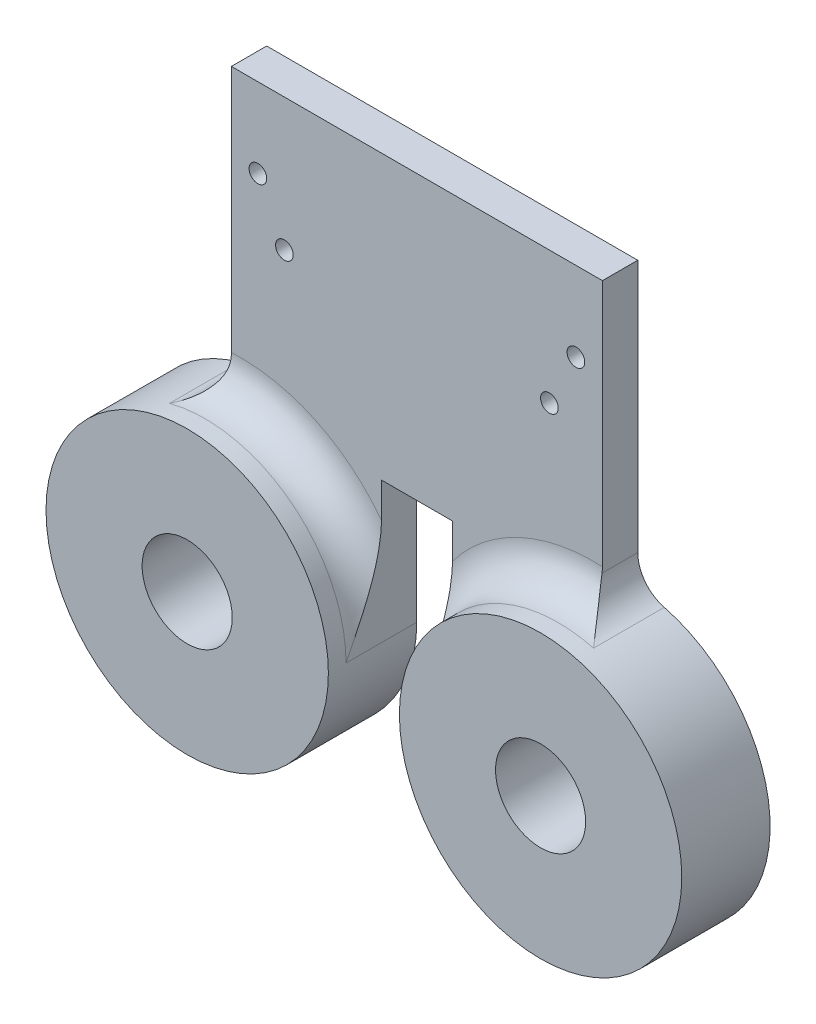
ISO-10303-21;
HEADER;
FILE_DESCRIPTION(('STEP AP214'),'2;1');
FILE_NAME('part.step','',(''),(''),'','','');
FILE_SCHEMA(('AUTOMOTIVE_DESIGN { 1 0 10303 214 1 1 1 1 }'));
ENDSEC;
DATA;
#1=APPLICATION_CONTEXT('core data for automotive mechanical design processes');
#2=APPLICATION_PROTOCOL_DEFINITION('international standard','automotive_design',2000,#1);
#3=PRODUCT_CONTEXT('',#1,'mechanical');
#4=PRODUCT('Part','Part','',(#3));
#5=PRODUCT_RELATED_PRODUCT_CATEGORY('part','',(#4));
#6=PRODUCT_DEFINITION_FORMATION('','',#4);
#7=PRODUCT_DEFINITION_CONTEXT('part definition',#1,'design');
#8=PRODUCT_DEFINITION('design','',#6,#7);
#9=PRODUCT_DEFINITION_SHAPE('','',#8);
#10=(LENGTH_UNIT() NAMED_UNIT(*) SI_UNIT(.MILLI.,.METRE.));
#11=(NAMED_UNIT(*) PLANE_ANGLE_UNIT() SI_UNIT($,.RADIAN.));
#12=(NAMED_UNIT(*) SI_UNIT($,.STERADIAN.) SOLID_ANGLE_UNIT());
#13=UNCERTAINTY_MEASURE_WITH_UNIT(LENGTH_MEASURE(1.E-05),#10,'distance_accuracy_value','');
#14=(GEOMETRIC_REPRESENTATION_CONTEXT(3) GLOBAL_UNCERTAINTY_ASSIGNED_CONTEXT((#13)) GLOBAL_UNIT_ASSIGNED_CONTEXT((#10,
#11,#12)) REPRESENTATION_CONTEXT('',''));
#15=CARTESIAN_POINT('',(0.,0.,0.));
#16=DIRECTION('',(0.,0.,1.));
#17=DIRECTION('',(1.,0.,0.));
#18=AXIS2_PLACEMENT_3D('',#15,#16,#17);
#19=CARTESIAN_POINT('',(-10.,-15.5,2.));
#20=DIRECTION('',(0.,0.,1.));
#21=DIRECTION('',(1.,0.,0.));
#22=AXIS2_PLACEMENT_3D('',#19,#20,#21);
#23=PLANE('',#22);
#24=CARTESIAN_POINT('',(9.,4.,2.));
#25=DIRECTION('',(0.,0.,1.));
#26=DIRECTION('',(1.,0.,0.));
#27=AXIS2_PLACEMENT_3D('',#24,#25,#26);
#28=CIRCLE('',#27,0.500000000000001);
#29=CARTESIAN_POINT('',(9.5,4.,2.));
#30=VERTEX_POINT('',#29);
#31=EDGE_CURVE('E321',#30,#30,#28,.F.);
#32=ORIENTED_EDGE('',*,*,#31,.T.);
#33=EDGE_LOOP('',(#32));
#34=FACE_BOUND('',#33,.T.);
#35=CARTESIAN_POINT('',(-9.,4.,2.));
#36=DIRECTION('',(0.,0.,1.));
#37=DIRECTION('',(1.,0.,0.));
#38=AXIS2_PLACEMENT_3D('',#35,#36,#37);
#39=CIRCLE('',#38,0.500000000000001);
#40=CARTESIAN_POINT('',(-8.5,4.,2.));
#41=VERTEX_POINT('',#40);
#42=EDGE_CURVE('E322',#41,#41,#39,.F.);
#43=ORIENTED_EDGE('',*,*,#42,.T.);
#44=EDGE_LOOP('',(#43));
#45=FACE_BOUND('',#44,.T.);
#46=CARTESIAN_POINT('',(-7.5,1.,2.));
#47=DIRECTION('',(0.,0.,1.));
#48=DIRECTION('',(1.,0.,0.));
#49=AXIS2_PLACEMENT_3D('',#46,#47,#48);
#50=CIRCLE('',#49,0.5);
#51=CARTESIAN_POINT('',(-7.,1.,2.));
#52=VERTEX_POINT('',#51);
#53=EDGE_CURVE('E326',#52,#52,#50,.F.);
#54=ORIENTED_EDGE('',*,*,#53,.T.);
#55=EDGE_LOOP('',(#54));
#56=FACE_BOUND('',#55,.T.);
#57=CARTESIAN_POINT('',(7.5,1.,2.));
#58=DIRECTION('',(0.,0.,1.));
#59=DIRECTION('',(1.,0.,0.));
#60=AXIS2_PLACEMENT_3D('',#57,#58,#59);
#61=CIRCLE('',#60,0.5);
#62=CARTESIAN_POINT('',(8.,1.,2.));
#63=VERTEX_POINT('',#62);
#64=EDGE_CURVE('E521',#63,#63,#61,.F.);
#65=ORIENTED_EDGE('',*,*,#64,.T.);
#66=EDGE_LOOP('',(#65));
#67=FACE_BOUND('',#66,.T.);
#68=DIRECTION('',(0.,-1.,0.));
#69=VECTOR('',#68,1.);
#70=CARTESIAN_POINT('',(2.00940408272331,-15.5,2.));
#71=LINE('',#70,#69);
#72=CARTESIAN_POINT('',(2.00940408272331,-7.52506281446691,2.));
#73=VERTEX_POINT('',#72);
#74=CARTESIAN_POINT('',(2.00940408272331,-9.50313551352821,2.));
#75=VERTEX_POINT('',#74);
#76=EDGE_CURVE('E298',#73,#75,#71,.T.);
#77=ORIENTED_EDGE('',*,*,#76,.T.);
#78=CARTESIAN_POINT('',(9.99999999999999,-15.5,2.));
#79=DIRECTION('',(0.,0.,1.));
#80=DIRECTION('',(1.,0.,0.));
#81=AXIS2_PLACEMENT_3D('',#78,#79,#80);
#82=CIRCLE('',#81,9.99059591727669);
#83=CARTESIAN_POINT('',(10.5,-5.52192369330116,2.));
#84=VERTEX_POINT('',#83);
#85=EDGE_CURVE('E137',#75,#84,#82,.F.);
#86=ORIENTED_EDGE('',*,*,#85,.T.);
#87=DIRECTION('',(0.,1.,0.));
#88=VECTOR('',#87,1.);
#89=CARTESIAN_POINT('',(10.5,-7.52506281446691,2.));
#90=LINE('',#89,#88);
#91=CARTESIAN_POINT('',(10.5,8.5,2.));
#92=VERTEX_POINT('',#91);
#93=EDGE_CURVE('E130',#84,#92,#90,.T.);
#94=ORIENTED_EDGE('',*,*,#93,.T.);
#95=DIRECTION('',(-1.,0.,0.));
#96=VECTOR('',#95,1.);
#97=CARTESIAN_POINT('',(-10.5,8.5,2.));
#98=LINE('',#97,#96);
#99=CARTESIAN_POINT('',(-10.5,8.5,2.));
#100=VERTEX_POINT('',#99);
#101=EDGE_CURVE('E134',#92,#100,#98,.T.);
#102=ORIENTED_EDGE('',*,*,#101,.T.);
#103=DIRECTION('',(0.,-1.,0.));
#104=VECTOR('',#103,1.);
#105=CARTESIAN_POINT('',(-10.5,-7.52506281446691,2.));
#106=LINE('',#105,#104);
#107=CARTESIAN_POINT('',(-10.5,-5.52192369330114,2.));
#108=VERTEX_POINT('',#107);
#109=EDGE_CURVE('E149',#100,#108,#106,.T.);
#110=ORIENTED_EDGE('',*,*,#109,.T.);
#111=CARTESIAN_POINT('',(-10.,-15.5,2.));
#112=DIRECTION('',(0.,0.,1.));
#113=DIRECTION('',(1.,0.,0.));
#114=AXIS2_PLACEMENT_3D('',#111,#112,#113);
#115=CIRCLE('',#114,9.99059591727667);
#116=CARTESIAN_POINT('',(-2.00940408272333,-9.50313551352821,2.));
#117=VERTEX_POINT('',#116);
#118=EDGE_CURVE('E155',#108,#117,#115,.F.);
#119=ORIENTED_EDGE('',*,*,#118,.T.);
#120=DIRECTION('',(0.,1.,0.));
#121=VECTOR('',#120,1.);
#122=CARTESIAN_POINT('',(-2.00940408272333,-15.5,2.));
#123=LINE('',#122,#121);
#124=CARTESIAN_POINT('',(-2.00940408272333,-7.52506281446691,2.));
#125=VERTEX_POINT('',#124);
#126=EDGE_CURVE('E302',#117,#125,#123,.T.);
#127=ORIENTED_EDGE('',*,*,#126,.T.);
#128=DIRECTION('',(1.,0.,0.));
#129=VECTOR('',#128,1.);
#130=CARTESIAN_POINT('',(-2.00940408272333,-7.52506281446691,2.));
#131=LINE('',#130,#129);
#132=EDGE_CURVE('E282',#125,#73,#131,.T.);
#133=ORIENTED_EDGE('',*,*,#132,.T.);
#134=EDGE_LOOP('',(#77,#86,#94,#102,#110,#119,#127,#133));
#135=FACE_BOUND('',#134,.T.);
#136=ADVANCED_FACE('F33',(#34,#45,#56,#67,#135),#23,.T.);
#137=CARTESIAN_POINT('',(-10.,-15.5,0.));
#138=DIRECTION('',(0.,0.,1.));
#139=DIRECTION('',(1.,0.,0.));
#140=AXIS2_PLACEMENT_3D('',#137,#138,#139);
#141=PLANE('',#140);
#142=CARTESIAN_POINT('',(9.,4.,0.));
#143=DIRECTION('',(0.,0.,1.));
#144=DIRECTION('',(1.,0.,0.));
#145=AXIS2_PLACEMENT_3D('',#142,#143,#144);
#146=CIRCLE('',#145,0.500000000000001);
#147=CARTESIAN_POINT('',(9.5,4.,0.));
#148=VERTEX_POINT('',#147);
#149=EDGE_CURVE('E520',#148,#148,#146,.T.);
#150=ORIENTED_EDGE('',*,*,#149,.T.);
#151=EDGE_LOOP('',(#150));
#152=FACE_BOUND('',#151,.T.);
#153=CARTESIAN_POINT('',(-9.,4.,0.));
#154=DIRECTION('',(0.,0.,1.));
#155=DIRECTION('',(-1.,0.,0.));
#156=AXIS2_PLACEMENT_3D('',#153,#154,#155);
#157=CIRCLE('',#156,0.500000000000001);
#158=CARTESIAN_POINT('',(-9.5,4.,0.));
#159=VERTEX_POINT('',#158);
#160=EDGE_CURVE('E522',#159,#159,#157,.T.);
#161=ORIENTED_EDGE('',*,*,#160,.T.);
#162=EDGE_LOOP('',(#161));
#163=FACE_BOUND('',#162,.T.);
#164=CARTESIAN_POINT('',(-7.5,1.,0.));
#165=DIRECTION('',(0.,0.,1.));
#166=DIRECTION('',(1.,0.,0.));
#167=AXIS2_PLACEMENT_3D('',#164,#165,#166);
#168=CIRCLE('',#167,0.5);
#169=CARTESIAN_POINT('',(-7.,1.,0.));
#170=VERTEX_POINT('',#169);
#171=EDGE_CURVE('E527',#170,#170,#168,.T.);
#172=ORIENTED_EDGE('',*,*,#171,.T.);
#173=EDGE_LOOP('',(#172));
#174=FACE_BOUND('',#173,.T.);
#175=CARTESIAN_POINT('',(7.5,1.,0.));
#176=DIRECTION('',(0.,0.,1.));
#177=DIRECTION('',(-1.,0.,0.));
#178=AXIS2_PLACEMENT_3D('',#175,#176,#177);
#179=CIRCLE('',#178,0.5);
#180=CARTESIAN_POINT('',(7.,1.,0.));
#181=VERTEX_POINT('',#180);
#182=EDGE_CURVE('E532',#181,#181,#179,.T.);
#183=ORIENTED_EDGE('',*,*,#182,.T.);
#184=EDGE_LOOP('',(#183));
#185=FACE_BOUND('',#184,.T.);
#186=CARTESIAN_POINT('',(9.99999999999999,-15.5,0.));
#187=DIRECTION('',(0.,0.,1.));
#188=DIRECTION('',(-1.,0.,0.));
#189=AXIS2_PLACEMENT_3D('',#186,#187,#188);
#190=CIRCLE('',#189,7.9905959172767);
#191=CARTESIAN_POINT('',(2.00940408272331,-15.5,0.));
#192=VERTEX_POINT('',#191);
#193=CARTESIAN_POINT('',(11.9995293532637,-7.76362452574626,0.));
#194=VERTEX_POINT('',#193);
#195=EDGE_CURVE('E140',#192,#194,#190,.T.);
#196=ORIENTED_EDGE('',*,*,#195,.F.);
#197=DIRECTION('',(0.,-1.,0.));
#198=VECTOR('',#197,1.);
#199=CARTESIAN_POINT('',(2.00940408272331,-15.5,0.));
#200=LINE('',#199,#198);
#201=CARTESIAN_POINT('',(2.00940408272331,-7.52506281446691,0.));
#202=VERTEX_POINT('',#201);
#203=EDGE_CURVE('E288',#202,#192,#200,.T.);
#204=ORIENTED_EDGE('',*,*,#203,.F.);
#205=DIRECTION('',(1.,0.,0.));
#206=VECTOR('',#205,1.);
#207=CARTESIAN_POINT('',(-2.00940408272333,-7.52506281446691,0.));
#208=LINE('',#207,#206);
#209=CARTESIAN_POINT('',(-2.00940408272333,-7.52506281446691,0.));
#210=VERTEX_POINT('',#209);
#211=EDGE_CURVE('E277',#210,#202,#208,.T.);
#212=ORIENTED_EDGE('',*,*,#211,.F.);
#213=DIRECTION('',(0.,1.,0.));
#214=VECTOR('',#213,1.);
#215=CARTESIAN_POINT('',(-2.00940408272333,-15.5,0.));
#216=LINE('',#215,#214);
#217=CARTESIAN_POINT('',(-2.00940408272333,-15.5,0.));
#218=VERTEX_POINT('',#217);
#219=EDGE_CURVE('E268',#218,#210,#216,.T.);
#220=ORIENTED_EDGE('',*,*,#219,.F.);
#221=CARTESIAN_POINT('',(-10.,-15.5,0.));
#222=DIRECTION('',(0.,0.,1.));
#223=DIRECTION('',(1.,0.,0.));
#224=AXIS2_PLACEMENT_3D('',#221,#222,#223);
#225=CIRCLE('',#224,7.99059591727667);
#226=CARTESIAN_POINT('',(-11.9995293532638,-7.76362452574624,0.));
#227=VERTEX_POINT('',#226);
#228=EDGE_CURVE('E278',#227,#218,#225,.T.);
#229=ORIENTED_EDGE('',*,*,#228,.F.);
#230=CARTESIAN_POINT('',(-12.5,-5.82725443411721,0.));
#231=DIRECTION('',(0.,0.,1.));
#232=DIRECTION('',(1.,0.,0.));
#233=AXIS2_PLACEMENT_3D('',#230,#231,#232);
#234=CIRCLE('',#233,2.);
#235=CARTESIAN_POINT('',(-10.5,-5.82725443411721,0.));
#236=VERTEX_POINT('',#235);
#237=EDGE_CURVE('E314',#227,#236,#234,.T.);
#238=ORIENTED_EDGE('',*,*,#237,.T.);
#239=DIRECTION('',(0.,-1.,0.));
#240=VECTOR('',#239,1.);
#241=CARTESIAN_POINT('',(-10.5,-7.52506281446691,0.));
#242=LINE('',#241,#240);
#243=CARTESIAN_POINT('',(-10.5,8.5,0.));
#244=VERTEX_POINT('',#243);
#245=EDGE_CURVE('E310',#244,#236,#242,.T.);
#246=ORIENTED_EDGE('',*,*,#245,.F.);
#247=DIRECTION('',(-1.,0.,0.));
#248=VECTOR('',#247,1.);
#249=CARTESIAN_POINT('',(-10.5,8.5,0.));
#250=LINE('',#249,#248);
#251=CARTESIAN_POINT('',(10.5,8.5,0.));
#252=VERTEX_POINT('',#251);
#253=EDGE_CURVE('E307',#252,#244,#250,.T.);
#254=ORIENTED_EDGE('',*,*,#253,.F.);
#255=DIRECTION('',(0.,1.,0.));
#256=VECTOR('',#255,1.);
#257=CARTESIAN_POINT('',(10.5,-7.52506281446691,0.));
#258=LINE('',#257,#256);
#259=CARTESIAN_POINT('',(10.5,-5.82725443411723,0.));
#260=VERTEX_POINT('',#259);
#261=EDGE_CURVE('E153',#260,#252,#258,.T.);
#262=ORIENTED_EDGE('',*,*,#261,.F.);
#263=CARTESIAN_POINT('',(12.5,-5.82725443411723,0.));
#264=DIRECTION('',(0.,0.,1.));
#265=DIRECTION('',(1.,0.,0.));
#266=AXIS2_PLACEMENT_3D('',#263,#264,#265);
#267=CIRCLE('',#266,2.);
#268=EDGE_CURVE('E316',#260,#194,#267,.T.);
#269=ORIENTED_EDGE('',*,*,#268,.T.);
#270=EDGE_LOOP('',(#196,#204,#212,#220,#229,#238,#246,#254,#262,#269));
#271=FACE_BOUND('',#270,.T.);
#272=CARTESIAN_POINT('',(9.99999999999999,-15.5,0.));
#273=DIRECTION('',(0.,0.,1.));
#274=DIRECTION('',(-1.,0.,0.));
#275=AXIS2_PLACEMENT_3D('',#272,#273,#274);
#276=CIRCLE('',#275,2.55);
#277=CARTESIAN_POINT('',(7.44999999999998,-15.5,0.));
#278=VERTEX_POINT('',#277);
#279=EDGE_CURVE('E341',#278,#278,#276,.T.);
#280=ORIENTED_EDGE('',*,*,#279,.T.);
#281=EDGE_LOOP('',(#280));
#282=FACE_BOUND('',#281,.T.);
#283=CARTESIAN_POINT('',(-10.,-15.5,0.));
#284=DIRECTION('',(0.,0.,1.));
#285=DIRECTION('',(1.,0.,0.));
#286=AXIS2_PLACEMENT_3D('',#283,#284,#285);
#287=CIRCLE('',#286,2.55);
#288=CARTESIAN_POINT('',(-7.45,-15.5,0.));
#289=VERTEX_POINT('',#288);
#290=EDGE_CURVE('E308',#289,#289,#287,.T.);
#291=ORIENTED_EDGE('',*,*,#290,.T.);
#292=EDGE_LOOP('',(#291));
#293=FACE_BOUND('',#292,.T.);
#294=ADVANCED_FACE('F231',(#152,#163,#174,#185,#271,#282,#293),#141,.F.);
#295=CARTESIAN_POINT('',(10.5,-7.52506281446691,2.));
#296=DIRECTION('',(-1.,0.,0.));
#297=DIRECTION('',(0.,0.,1.));
#298=AXIS2_PLACEMENT_3D('',#295,#296,#297);
#299=PLANE('',#298);
#300=CARTESIAN_POINT('',(10.5,-5.52192369330116,2.));
#301=CARTESIAN_POINT('',(10.5,-5.57311016810667,2.00000580903618));
#302=CARTESIAN_POINT('',(10.5,-5.62414763540946,2.00195731331108));
#303=CARTESIAN_POINT('',(10.5,-5.7259245489795,2.00975171187656));
#304=CARTESIAN_POINT('',(10.5,-5.77666399528208,2.01559460570602));
#305=CARTESIAN_POINT('',(10.5,-5.82725443411723,2.0233831943131));
#306=B_SPLINE_CURVE_WITH_KNOTS('',3,(#300,#301,#302,#303,#304,#305),.UNSPECIFIED.,.F.,.F.,(4,2,
4),(0.,0.153224289649395,0.306448561142343),.UNSPECIFIED.);
#307=CARTESIAN_POINT('',(10.5,-5.82725443411723,2.0233831943131));
#308=VERTEX_POINT('',#307);
#309=EDGE_CURVE('E175',#84,#308,#306,.T.);
#310=ORIENTED_EDGE('',*,*,#309,.T.);
#311=DIRECTION('',(0.,0.,1.));
#312=VECTOR('',#311,1.);
#313=CARTESIAN_POINT('',(10.5,-5.82725443411723,0.));
#314=LINE('',#313,#312);
#315=EDGE_CURVE('E62',#308,#260,#314,.F.);
#316=ORIENTED_EDGE('',*,*,#315,.T.);
#317=ORIENTED_EDGE('',*,*,#261,.T.);
#318=DIRECTION('',(0.,0.,-1.));
#319=VECTOR('',#318,1.);
#320=CARTESIAN_POINT('',(10.5,8.5,2.));
#321=LINE('',#320,#319);
#322=EDGE_CURVE('E145',#92,#252,#321,.T.);
#323=ORIENTED_EDGE('',*,*,#322,.F.);
#324=ORIENTED_EDGE('',*,*,#93,.F.);
#325=EDGE_LOOP('',(#310,#316,#317,#323,#324));
#326=FACE_BOUND('',#325,.T.);
#327=ADVANCED_FACE('F151',(#326),#299,.F.);
#328=CARTESIAN_POINT('',(-10.5,8.5,2.));
#329=DIRECTION('',(0.,-1.,0.));
#330=DIRECTION('',(0.,0.,-1.));
#331=AXIS2_PLACEMENT_3D('',#328,#329,#330);
#332=PLANE('',#331);
#333=ORIENTED_EDGE('',*,*,#253,.T.);
#334=DIRECTION('',(0.,0.,-1.));
#335=VECTOR('',#334,1.);
#336=CARTESIAN_POINT('',(-10.5,8.5,2.));
#337=LINE('',#336,#335);
#338=EDGE_CURVE('E147',#100,#244,#337,.T.);
#339=ORIENTED_EDGE('',*,*,#338,.F.);
#340=ORIENTED_EDGE('',*,*,#101,.F.);
#341=ORIENTED_EDGE('',*,*,#322,.T.);
#342=EDGE_LOOP('',(#333,#339,#340,#341));
#343=FACE_BOUND('',#342,.T.);
#344=ADVANCED_FACE('F144',(#343),#332,.F.);
#345=CARTESIAN_POINT('',(-10.5,-7.52506281446691,2.));
#346=DIRECTION('',(1.,0.,0.));
#347=DIRECTION('',(0.,0.,-1.));
#348=AXIS2_PLACEMENT_3D('',#345,#346,#347);
#349=PLANE('',#348);
#350=ORIENTED_EDGE('',*,*,#245,.T.);
#351=DIRECTION('',(0.,0.,1.));
#352=VECTOR('',#351,1.);
#353=CARTESIAN_POINT('',(-10.5,-5.82725443411721,2.));
#354=LINE('',#353,#352);
#355=CARTESIAN_POINT('',(-10.5,-5.82725443411721,2.0233831943131));
#356=VERTEX_POINT('',#355);
#357=EDGE_CURVE('E54',#236,#356,#354,.T.);
#358=ORIENTED_EDGE('',*,*,#357,.T.);
#359=CARTESIAN_POINT('',(-10.5,-5.82725443411721,2.0233831943131));
#360=CARTESIAN_POINT('',(-10.5,-5.77666399528205,2.01559460570603));
#361=CARTESIAN_POINT('',(-10.5,-5.72592454897948,2.00975171187657));
#362=CARTESIAN_POINT('',(-10.5,-5.62414763540944,2.00195731331107));
#363=CARTESIAN_POINT('',(-10.5,-5.57311016810666,2.00000580903615));
#364=CARTESIAN_POINT('',(-10.5,-5.52192369330115,1.99999999999994));
#365=B_SPLINE_CURVE_WITH_KNOTS('',3,(#359,#360,#361,#362,#363,#364),.UNSPECIFIED.,.F.,.F.,(4,2,
4),(0.,0.153224271492945,0.306448561142335),.UNSPECIFIED.);
#366=EDGE_CURVE('E11',#356,#108,#365,.T.);
#367=ORIENTED_EDGE('',*,*,#366,.T.);
#368=ORIENTED_EDGE('',*,*,#109,.F.);
#369=ORIENTED_EDGE('',*,*,#338,.T.);
#370=EDGE_LOOP('',(#350,#358,#367,#368,#369));
#371=FACE_BOUND('',#370,.T.);
#372=ADVANCED_FACE('F222',(#371),#349,.F.);
#373=CARTESIAN_POINT('',(-10.,-15.5,2.));
#374=DIRECTION('',(0.,0.,-1.));
#375=DIRECTION('',(-1.,0.,0.));
#376=AXIS2_PLACEMENT_3D('',#373,#374,#375);
#377=CYLINDRICAL_SURFACE('',#376,7.99059591727667);
#378=CARTESIAN_POINT('',(-10.,-15.5,4.));
#379=DIRECTION('',(0.,0.,1.));
#380=DIRECTION('',(1.,0.,0.));
#381=AXIS2_PLACEMENT_3D('',#378,#379,#380);
#382=CIRCLE('',#381,7.99059591727667);
#383=CARTESIAN_POINT('',(-2.00940408272333,-15.5,4.));
#384=VERTEX_POINT('',#383);
#385=CARTESIAN_POINT('',(-11.9995293532638,-7.76362452574624,4.));
#386=VERTEX_POINT('',#385);
#387=EDGE_CURVE('E169',#384,#386,#382,.T.);
#388=ORIENTED_EDGE('',*,*,#387,.T.);
#389=DIRECTION('',(0.,0.,-1.));
#390=VECTOR('',#389,1.);
#391=CARTESIAN_POINT('',(-11.9995293532638,-7.76362452574624,2.));
#392=LINE('',#391,#390);
#393=EDGE_CURVE('E171',#386,#227,#392,.T.);
#394=ORIENTED_EDGE('',*,*,#393,.T.);
#395=ORIENTED_EDGE('',*,*,#228,.T.);
#396=DIRECTION('',(0.,0.,-1.));
#397=VECTOR('',#396,1.);
#398=CARTESIAN_POINT('',(-2.00940408272333,-15.5,2.));
#399=LINE('',#398,#397);
#400=EDGE_CURVE('E158',#384,#218,#399,.T.);
#401=ORIENTED_EDGE('',*,*,#400,.F.);
#402=EDGE_LOOP('',(#388,#394,#395,#401));
#403=FACE_BOUND('',#402,.T.);
#404=CARTESIAN_POINT('',(-10.,-15.5,5.));
#405=DIRECTION('',(0.,0.,1.));
#406=DIRECTION('',(1.,0.,0.));
#407=AXIS2_PLACEMENT_3D('',#404,#405,#406);
#408=CIRCLE('',#407,7.99059591727667);
#409=CARTESIAN_POINT('',(-2.00940408272333,-15.5,5.));
#410=VERTEX_POINT('',#409);
#411=EDGE_CURVE('E338',#410,#410,#408,.T.);
#412=ORIENTED_EDGE('',*,*,#411,.F.);
#413=EDGE_LOOP('',(#412));
#414=FACE_BOUND('',#413,.T.);
#415=ADVANCED_FACE('F226',(#403,#414),#377,.T.);
#416=CARTESIAN_POINT('',(-2.00940408272333,-15.5,2.));
#417=DIRECTION('',(-1.,0.,0.));
#418=DIRECTION('',(0.,0.,1.));
#419=AXIS2_PLACEMENT_3D('',#416,#417,#418);
#420=PLANE('',#419);
#421=ORIENTED_EDGE('',*,*,#219,.T.);
#422=DIRECTION('',(0.,0.,-1.));
#423=VECTOR('',#422,1.);
#424=CARTESIAN_POINT('',(-2.00940408272333,-7.52506281446691,2.));
#425=LINE('',#424,#423);
#426=EDGE_CURVE('E271',#125,#210,#425,.T.);
#427=ORIENTED_EDGE('',*,*,#426,.F.);
#428=ORIENTED_EDGE('',*,*,#126,.F.);
#429=CARTESIAN_POINT('',(-2.00940408272333,-9.50313551352821,2.));
#430=CARTESIAN_POINT('',(-2.00940408272333,-9.60911079559248,2.0000093052869));
#431=CARTESIAN_POINT('',(-2.00940408272333,-9.71504452987865,2.00303348232571));
#432=CARTESIAN_POINT('',(-2.00940408272333,-9.926557500519,2.01456197953507));
#433=CARTESIAN_POINT('',(-2.00940408272333,-10.0321369043865,2.02306317815245));
#434=CARTESIAN_POINT('',(-2.00940408272333,-10.3474675373036,2.05589674103143));
#435=CARTESIAN_POINT('',(-2.00940408272333,-10.5564678989164,2.08756598145156));
#436=CARTESIAN_POINT('',(-2.00940408272333,-10.9686160502865,2.16632229953508));
#437=CARTESIAN_POINT('',(-2.00940408272333,-11.1718045780072,2.2132045141821));
#438=CARTESIAN_POINT('',(-2.00940408272333,-11.5749764794961,2.31963568819027));
#439=CARTESIAN_POINT('',(-2.00940408272333,-11.7749569406002,2.37919552735559));
#440=CARTESIAN_POINT('',(-2.00940408272333,-12.2769492173367,2.54282463222723));
#441=CARTESIAN_POINT('',(-2.00940408272333,-12.5767150858052,2.65372841014644));
#442=CARTESIAN_POINT('',(-2.00940408272333,-13.1695056677459,2.8919995560322));
#443=CARTESIAN_POINT('',(-2.00940408272333,-13.462529470863,3.01936913212215));
#444=CARTESIAN_POINT('',(-2.00940408272333,-14.3366581505906,3.41805087964037));
#445=CARTESIAN_POINT('',(-2.00940408272333,-14.9104607625905,3.70505755857131));
#446=CARTESIAN_POINT('',(-2.00940408272333,-15.4893408728622,3.99466731595865));
#447=CARTESIAN_POINT('',(-2.00940408272333,-15.4946704435201,3.99733366910997));
#448=CARTESIAN_POINT('',(-2.00940408272333,-15.5,4.));
#449=B_SPLINE_CURVE_WITH_KNOTS('',3,(#429,#430,#431,#432,#433,#434,#435,#436,#437,#438,#439,
#440,#441,#442,#443,#444,#445,#446,#447,#448),.UNSPECIFIED.,.F.,.F.,(4,2,2,2,2,2,2,2,2,4),(0.,
0.317817457767644,0.635453939890329,1.268765221025,1.89387937178499,2.51953216759222,
3.47762138244841,4.43583921409319,6.35980461736427,6.37768264400848),.UNSPECIFIED.);
#450=EDGE_CURVE('E47',#117,#384,#449,.T.);
#451=ORIENTED_EDGE('',*,*,#450,.T.);
#452=ORIENTED_EDGE('',*,*,#400,.T.);
#453=EDGE_LOOP('',(#421,#427,#428,#451,#452));
#454=FACE_BOUND('',#453,.T.);
#455=ADVANCED_FACE('F256',(#454),#420,.F.);
#456=CARTESIAN_POINT('',(-2.00940408272333,-7.52506281446691,2.));
#457=DIRECTION('',(0.,1.,0.));
#458=DIRECTION('',(-1.,0.,0.));
#459=AXIS2_PLACEMENT_3D('',#456,#457,#458);
#460=PLANE('',#459);
#461=ORIENTED_EDGE('',*,*,#211,.T.);
#462=DIRECTION('',(0.,0.,-1.));
#463=VECTOR('',#462,1.);
#464=CARTESIAN_POINT('',(2.00940408272331,-7.52506281446691,2.));
#465=LINE('',#464,#463);
#466=EDGE_CURVE('E283',#73,#202,#465,.T.);
#467=ORIENTED_EDGE('',*,*,#466,.F.);
#468=ORIENTED_EDGE('',*,*,#132,.F.);
#469=ORIENTED_EDGE('',*,*,#426,.T.);
#470=EDGE_LOOP('',(#461,#467,#468,#469));
#471=FACE_BOUND('',#470,.T.);
#472=ADVANCED_FACE('F253',(#471),#460,.F.);
#473=CARTESIAN_POINT('',(2.00940408272331,-15.5,2.));
#474=DIRECTION('',(1.,0.,0.));
#475=DIRECTION('',(0.,0.,-1.));
#476=AXIS2_PLACEMENT_3D('',#473,#474,#475);
#477=PLANE('',#476);
#478=ORIENTED_EDGE('',*,*,#203,.T.);
#479=DIRECTION('',(0.,0.,-1.));
#480=VECTOR('',#479,1.);
#481=CARTESIAN_POINT('',(2.00940408272331,-15.5,2.));
#482=LINE('',#481,#480);
#483=CARTESIAN_POINT('',(2.00940408272329,-15.5,4.));
#484=VERTEX_POINT('',#483);
#485=EDGE_CURVE('E295',#484,#192,#482,.T.);
#486=ORIENTED_EDGE('',*,*,#485,.F.);
#487=CARTESIAN_POINT('',(2.00940408272331,-9.50313551352821,2.));
#488=CARTESIAN_POINT('',(2.00940408272331,-9.60911079559467,2.0000093052869));
#489=CARTESIAN_POINT('',(2.00940408272331,-9.71504452988302,2.00303348232584));
#490=CARTESIAN_POINT('',(2.00940408272331,-9.92655750052773,2.01456197953566));
#491=CARTESIAN_POINT('',(2.00940408272331,-10.0321369043974,2.02306317815338));
#492=CARTESIAN_POINT('',(2.00940408272331,-10.34746753732,2.05589674103354));
#493=CARTESIAN_POINT('',(2.00940408272331,-10.5564678989362,2.08756598145468));
#494=CARTESIAN_POINT('',(2.00940408272331,-10.9686160503053,2.16632229953931));
#495=CARTESIAN_POINT('',(2.00940408272331,-11.1718045780218,2.21320451418586));
#496=CARTESIAN_POINT('',(2.00940408272331,-11.5749764795032,2.31963568819221));
#497=CARTESIAN_POINT('',(2.00940408272331,-11.7749569406039,2.3791955273562));
#498=CARTESIAN_POINT('',(2.00940408272331,-12.2769492173357,2.54282463222783));
#499=CARTESIAN_POINT('',(2.00940408272332,-12.5767150858023,2.65372841014968));
#500=CARTESIAN_POINT('',(2.0094040827233,-13.1695056677445,2.89199955602723));
#501=CARTESIAN_POINT('',(2.00940408272328,-13.4625294708651,3.01936913210629));
#502=CARTESIAN_POINT('',(2.00940408272338,-14.3366581505726,3.41805087966605));
#503=CARTESIAN_POINT('',(2.00940408272368,-14.9104607625124,3.70505755872232));
#504=CARTESIAN_POINT('',(2.00940408272331,-15.4893408728609,3.99466731596147));
#505=CARTESIAN_POINT('',(2.00940408272331,-15.4946704435194,3.99733366911139));
#506=CARTESIAN_POINT('',(2.0094040827233,-15.5,4.));
#507=B_SPLINE_CURVE_WITH_KNOTS('',3,(#487,#488,#489,#490,#491,#492,#493,#494,#495,#496,#497,
#498,#499,#500,#501,#502,#503,#504,#505,#506),.UNSPECIFIED.,.F.,.F.,(4,2,2,2,2,2,2,2,2,4),(0.,
0.317817457774199,0.63545393990345,1.26876522104838,1.8938793717959,2.5195321675922,
3.47762138244662,4.43583921408629,6.35980461736425,6.37768264400845),.UNSPECIFIED.);
#508=EDGE_CURVE('E183',#484,#75,#507,.F.);
#509=ORIENTED_EDGE('',*,*,#508,.T.);
#510=ORIENTED_EDGE('',*,*,#76,.F.);
#511=ORIENTED_EDGE('',*,*,#466,.T.);
#512=EDGE_LOOP('',(#478,#486,#509,#510,#511));
#513=FACE_BOUND('',#512,.T.);
#514=ADVANCED_FACE('F248',(#513),#477,.F.);
#515=CARTESIAN_POINT('',(9.99999999999999,-15.5,2.));
#516=DIRECTION('',(0.,0.,-1.));
#517=DIRECTION('',(-1.,0.,0.));
#518=AXIS2_PLACEMENT_3D('',#515,#516,#517);
#519=CYLINDRICAL_SURFACE('',#518,7.9905959172767);
#520=CARTESIAN_POINT('',(9.99999999999999,-15.5,4.));
#521=DIRECTION('',(0.,0.,1.));
#522=DIRECTION('',(1.,0.,0.));
#523=AXIS2_PLACEMENT_3D('',#520,#521,#522);
#524=CIRCLE('',#523,7.9905959172767);
#525=CARTESIAN_POINT('',(11.9995293532637,-7.76362452574626,4.));
#526=VERTEX_POINT('',#525);
#527=EDGE_CURVE('E165',#526,#484,#524,.T.);
#528=ORIENTED_EDGE('',*,*,#527,.T.);
#529=ORIENTED_EDGE('',*,*,#485,.T.);
#530=ORIENTED_EDGE('',*,*,#195,.T.);
#531=DIRECTION('',(0.,0.,-1.));
#532=VECTOR('',#531,1.);
#533=CARTESIAN_POINT('',(11.9995293532637,-7.76362452574625,2.));
#534=LINE('',#533,#532);
#535=EDGE_CURVE('E163',#194,#526,#534,.F.);
#536=ORIENTED_EDGE('',*,*,#535,.T.);
#537=EDGE_LOOP('',(#528,#529,#530,#536));
#538=FACE_BOUND('',#537,.T.);
#539=CARTESIAN_POINT('',(9.99999999999999,-15.5,5.));
#540=DIRECTION('',(0.,0.,1.));
#541=DIRECTION('',(1.,0.,0.));
#542=AXIS2_PLACEMENT_3D('',#539,#540,#541);
#543=CIRCLE('',#542,7.99059591727668);
#544=CARTESIAN_POINT('',(17.9905959172767,-15.5,5.));
#545=VERTEX_POINT('',#544);
#546=EDGE_CURVE('E332',#545,#545,#543,.T.);
#547=ORIENTED_EDGE('',*,*,#546,.F.);
#548=EDGE_LOOP('',(#547));
#549=FACE_BOUND('',#548,.T.);
#550=ADVANCED_FACE('F246',(#538,#549),#519,.T.);
#551=CARTESIAN_POINT('',(-10.,-15.5,2.));
#552=DIRECTION('',(0.,0.,-1.));
#553=DIRECTION('',(-1.,0.,0.));
#554=AXIS2_PLACEMENT_3D('',#551,#552,#553);
#555=CYLINDRICAL_SURFACE('',#554,2.55);
#556=ORIENTED_EDGE('',*,*,#290,.F.);
#557=EDGE_LOOP('',(#556));
#558=FACE_BOUND('',#557,.T.);
#559=CARTESIAN_POINT('',(-10.,-15.5,5.));
#560=DIRECTION('',(0.,0.,1.));
#561=DIRECTION('',(1.,0.,0.));
#562=AXIS2_PLACEMENT_3D('',#559,#560,#561);
#563=CIRCLE('',#562,2.55);
#564=CARTESIAN_POINT('',(-7.45,-15.5,5.));
#565=VERTEX_POINT('',#564);
#566=EDGE_CURVE('E335',#565,#565,#563,.T.);
#567=ORIENTED_EDGE('',*,*,#566,.T.);
#568=EDGE_LOOP('',(#567));
#569=FACE_BOUND('',#568,.T.);
#570=ADVANCED_FACE('F243',(#558,#569),#555,.F.);
#571=CARTESIAN_POINT('',(9.99999999999999,-15.5,2.));
#572=DIRECTION('',(0.,0.,-1.));
#573=DIRECTION('',(-1.,0.,0.));
#574=AXIS2_PLACEMENT_3D('',#571,#572,#573);
#575=CYLINDRICAL_SURFACE('',#574,2.55);
#576=ORIENTED_EDGE('',*,*,#279,.F.);
#577=EDGE_LOOP('',(#576));
#578=FACE_BOUND('',#577,.T.);
#579=CARTESIAN_POINT('',(9.99999999999999,-15.5,5.));
#580=DIRECTION('',(0.,0.,1.));
#581=DIRECTION('',(1.,0.,0.));
#582=AXIS2_PLACEMENT_3D('',#579,#580,#581);
#583=CIRCLE('',#582,2.55);
#584=CARTESIAN_POINT('',(12.55,-15.5,5.));
#585=VERTEX_POINT('',#584);
#586=EDGE_CURVE('E209',#585,#585,#583,.T.);
#587=ORIENTED_EDGE('',*,*,#586,.T.);
#588=EDGE_LOOP('',(#587));
#589=FACE_BOUND('',#588,.T.);
#590=ADVANCED_FACE('F375',(#578,#589),#575,.F.);
#591=CARTESIAN_POINT('',(-10.,-15.5,5.));
#592=DIRECTION('',(0.,0.,1.));
#593=DIRECTION('',(1.,0.,0.));
#594=AXIS2_PLACEMENT_3D('',#591,#592,#593);
#595=PLANE('',#594);
#596=ORIENTED_EDGE('',*,*,#411,.T.);
#597=EDGE_LOOP('',(#596));
#598=FACE_BOUND('',#597,.T.);
#599=ORIENTED_EDGE('',*,*,#566,.F.);
#600=EDGE_LOOP('',(#599));
#601=FACE_BOUND('',#600,.T.);
#602=ADVANCED_FACE('F372',(#598,#601),#595,.T.);
#603=CARTESIAN_POINT('',(9.99999999999999,-15.5,5.));
#604=DIRECTION('',(0.,0.,1.));
#605=DIRECTION('',(1.,0.,0.));
#606=AXIS2_PLACEMENT_3D('',#603,#604,#605);
#607=PLANE('',#606);
#608=ORIENTED_EDGE('',*,*,#546,.T.);
#609=EDGE_LOOP('',(#608));
#610=FACE_BOUND('',#609,.T.);
#611=ORIENTED_EDGE('',*,*,#586,.F.);
#612=EDGE_LOOP('',(#611));
#613=FACE_BOUND('',#612,.T.);
#614=ADVANCED_FACE('F369',(#610,#613),#607,.T.);
#615=CARTESIAN_POINT('',(12.5,-5.82725443411723,2.));
#616=DIRECTION('',(0.,0.,-1.));
#617=DIRECTION('',(-1.,0.,0.));
#618=AXIS2_PLACEMENT_3D('',#615,#616,#617);
#619=CYLINDRICAL_SURFACE('',#618,2.);
#620=ORIENTED_EDGE('',*,*,#315,.F.);
#621=CARTESIAN_POINT('',(10.5,-5.82725443411723,2.0233831943131));
#622=CARTESIAN_POINT('',(10.4999883143867,-5.87524153810048,2.03076282912122));
#623=CARTESIAN_POINT('',(10.5017264512172,-5.9229365537522,2.03989417022175));
#624=CARTESIAN_POINT('',(10.5084900169515,-6.0172774218884,2.06143980160786));
#625=CARTESIAN_POINT('',(10.5135110235011,-6.06392459860098,2.07384966201636));
#626=CARTESIAN_POINT('',(10.5265604860192,-6.15535546929622,2.10160694565012));
#627=CARTESIAN_POINT('',(10.5345569473769,-6.20015354795288,2.11692229719688));
#628=CARTESIAN_POINT('',(10.5533021498628,-6.28811401339987,2.15031340690814));
#629=CARTESIAN_POINT('',(10.564051722325,-6.33127590159606,2.16838999819461));
#630=CARTESIAN_POINT('',(10.5998951131162,-6.45750323360314,2.22614706075099));
#631=CARTESIAN_POINT('',(10.6286697796121,-6.53787343944575,2.26953062435551));
#632=CARTESIAN_POINT('',(10.694004849916,-6.69057262446349,2.36412039890199));
#633=CARTESIAN_POINT('',(10.730587709027,-6.76287747564261,2.41534904857664));
#634=CARTESIAN_POINT('',(10.8336056598494,-6.94041227264899,2.55644995152889));
#635=CARTESIAN_POINT('',(10.9047391348662,-7.03920285993763,2.65099603557891));
#636=CARTESIAN_POINT('',(11.0572330358847,-7.21730277651605,2.84980372812856));
#637=CARTESIAN_POINT('',(11.1386222241355,-7.2965553873622,2.95409243844501));
#638=CARTESIAN_POINT('',(11.2823440268263,-7.41569008890949,3.13553102048092));
#639=CARTESIAN_POINT('',(11.3428476541456,-7.46018688982078,3.2111732581014));
#640=CARTESIAN_POINT('',(11.4666840317485,-7.5412382561038,3.36444221914221));
#641=CARTESIAN_POINT('',(11.5300181772171,-7.57778885149466,3.44206991296425));
#642=CARTESIAN_POINT('',(11.6589015046694,-7.64322925096687,3.59835157141746));
#643=CARTESIAN_POINT('',(11.7244454210753,-7.67213599014527,3.67700285533357));
#644=CARTESIAN_POINT('',(11.8576066917968,-7.72261669239613,3.83488721640594));
#645=CARTESIAN_POINT('',(11.9252235357511,-7.74419244482303,3.91412014676291));
#646=CARTESIAN_POINT('',(11.9956816041116,-7.7626269786573,3.99555534252774));
#647=CARTESIAN_POINT('',(11.9976051186235,-7.7631271862442,3.99777768270921));
#648=CARTESIAN_POINT('',(11.9995293532637,-7.76362452574626,4.));
#649=B_SPLINE_CURVE_WITH_KNOTS('',3,(#621,#622,#623,#624,#625,#626,#627,#628,#629,#630,#631,
#632,#633,#634,#635,#636,#637,#638,#639,#640,#641,#642,#643,#644,#645,#646,#647,#648),
.UNSPECIFIED.,.F.,.F.,(4,2,2,2,2,2,2,2,2,2,2,2,2,4),(0.,0.145556985071984,0.290918293187005,
0.434759713591053,0.578644619903862,0.864648911909935,1.15148707099401,1.61130183031504,
2.07243610902969,2.39187538925741,2.71147389872312,3.03035828426219,3.34916478018207,
3.35810905650786),.UNSPECIFIED.);
#650=EDGE_CURVE('E203',#526,#308,#649,.F.);
#651=ORIENTED_EDGE('',*,*,#650,.F.);
#652=ORIENTED_EDGE('',*,*,#535,.F.);
#653=ORIENTED_EDGE('',*,*,#268,.F.);
#654=EDGE_LOOP('',(#620,#651,#652,#653));
#655=FACE_BOUND('',#654,.T.);
#656=ADVANCED_FACE('F197',(#655),#619,.F.);
#657=CARTESIAN_POINT('',(9.99999999999999,-15.5,4.));
#658=DIRECTION('',(0.,0.,1.));
#659=DIRECTION('',(1.,0.,0.));
#660=AXIS2_PLACEMENT_3D('',#657,#658,#659);
#661=TOROIDAL_SURFACE('',#660,9.99059591727669,2.);
#662=ORIENTED_EDGE('',*,*,#508,.F.);
#663=ORIENTED_EDGE('',*,*,#527,.F.);
#664=ORIENTED_EDGE('',*,*,#650,.T.);
#665=ORIENTED_EDGE('',*,*,#309,.F.);
#666=ORIENTED_EDGE('',*,*,#85,.F.);
#667=EDGE_LOOP('',(#662,#663,#664,#665,#666));
#668=FACE_BOUND('',#667,.T.);
#669=ADVANCED_FACE('F193',(#668),#661,.F.);
#670=CARTESIAN_POINT('',(-10.,-15.5,4.));
#671=DIRECTION('',(0.,0.,1.));
#672=DIRECTION('',(1.,0.,0.));
#673=AXIS2_PLACEMENT_3D('',#670,#671,#672);
#674=TOROIDAL_SURFACE('',#673,9.99059591727667,2.);
#675=ORIENTED_EDGE('',*,*,#118,.F.);
#676=ORIENTED_EDGE('',*,*,#366,.F.);
#677=CARTESIAN_POINT('',(-10.5,-5.82725443411721,2.0233831943131));
#678=CARTESIAN_POINT('',(-10.4999883143867,-5.87524153810046,2.03076282912122));
#679=CARTESIAN_POINT('',(-10.5017264512172,-5.92293655375218,2.03989417022175));
#680=CARTESIAN_POINT('',(-10.5084900169515,-6.01727742188838,2.06143980160786));
#681=CARTESIAN_POINT('',(-10.5135110235011,-6.06392459860097,2.07384966201636));
#682=CARTESIAN_POINT('',(-10.5265604860192,-6.1553554692962,2.10160694565013));
#683=CARTESIAN_POINT('',(-10.5345569473769,-6.20015354795286,2.11692229719688));
#684=CARTESIAN_POINT('',(-10.5533021498628,-6.28811401339985,2.15031340690814));
#685=CARTESIAN_POINT('',(-10.564051722325,-6.33127590159604,2.16838999819461));
#686=CARTESIAN_POINT('',(-10.5998951131162,-6.45750323360311,2.22614706075099));
#687=CARTESIAN_POINT('',(-10.628669779612,-6.53787343944572,2.26953062435551));
#688=CARTESIAN_POINT('',(-10.694004849916,-6.69057262446347,2.36412039890199));
#689=CARTESIAN_POINT('',(-10.730587709027,-6.76287747564259,2.41534904857664));
#690=CARTESIAN_POINT('',(-10.8336056598494,-6.94041227264898,2.55644995152889));
#691=CARTESIAN_POINT('',(-10.9047391348662,-7.03920285993762,2.65099603557891));
#692=CARTESIAN_POINT('',(-11.0572330358847,-7.21730277651604,2.84980372812857));
#693=CARTESIAN_POINT('',(-11.1386222241355,-7.29655538736217,2.95409243844502));
#694=CARTESIAN_POINT('',(-11.2823440268263,-7.41569008890947,3.13553102048091));
#695=CARTESIAN_POINT('',(-11.3428476541456,-7.46018688982077,3.21117325810136));
#696=CARTESIAN_POINT('',(-11.4666840317484,-7.54123825610377,3.36444221914223));
#697=CARTESIAN_POINT('',(-11.5300181772169,-7.5777888514946,3.44206991296435));
#698=CARTESIAN_POINT('',(-11.6589015046695,-7.64322925096688,3.59835157141732));
#699=CARTESIAN_POINT('',(-11.7244454210758,-7.67213599014537,3.67700285533311));
#700=CARTESIAN_POINT('',(-11.8576066917963,-7.72261669239598,3.83488721640638));
#701=CARTESIAN_POINT('',(-11.9252235357493,-7.74419244482252,3.91412014676458));
#702=CARTESIAN_POINT('',(-11.9956816041115,-7.76262697865725,3.99555534252783));
#703=CARTESIAN_POINT('',(-11.9976051186235,-7.76312718624416,3.99777768270926));
#704=CARTESIAN_POINT('',(-11.9995293532638,-7.76362452574624,4.));
#705=B_SPLINE_CURVE_WITH_KNOTS('',3,(#677,#678,#679,#680,#681,#682,#683,#684,#685,#686,#687,
#688,#689,#690,#691,#692,#693,#694,#695,#696,#697,#698,#699,#700,#701,#702,#703,#704),
.UNSPECIFIED.,.F.,.F.,(4,2,2,2,2,2,2,2,2,2,2,2,2,4),(0.,0.145556985071989,0.290918293187015,
0.434759713591058,0.578644619903861,0.864648911909926,1.15148707099401,1.61130183031506,
2.07243610902969,2.3918753892574,2.71147389872309,3.03035828426218,3.34916478018207,
3.35810905650786),.UNSPECIFIED.);
#706=EDGE_CURVE('E38',#386,#356,#705,.F.);
#707=ORIENTED_EDGE('',*,*,#706,.F.);
#708=ORIENTED_EDGE('',*,*,#387,.F.);
#709=ORIENTED_EDGE('',*,*,#450,.F.);
#710=EDGE_LOOP('',(#675,#676,#707,#708,#709));
#711=FACE_BOUND('',#710,.T.);
#712=ADVANCED_FACE('F196',(#711),#674,.F.);
#713=CARTESIAN_POINT('',(-12.5,-5.82725443411721,2.));
#714=DIRECTION('',(0.,0.,-1.));
#715=DIRECTION('',(-1.,0.,0.));
#716=AXIS2_PLACEMENT_3D('',#713,#714,#715);
#717=CYLINDRICAL_SURFACE('',#716,2.);
#718=ORIENTED_EDGE('',*,*,#706,.T.);
#719=ORIENTED_EDGE('',*,*,#357,.F.);
#720=ORIENTED_EDGE('',*,*,#237,.F.);
#721=ORIENTED_EDGE('',*,*,#393,.F.);
#722=EDGE_LOOP('',(#718,#719,#720,#721));
#723=FACE_BOUND('',#722,.T.);
#724=ADVANCED_FACE('F35',(#723),#717,.F.);
#725=CARTESIAN_POINT('',(7.5,1.,5.));
#726=DIRECTION('',(0.,0.,-1.));
#727=DIRECTION('',(-1.,0.,0.));
#728=AXIS2_PLACEMENT_3D('',#725,#726,#727);
#729=CYLINDRICAL_SURFACE('',#728,0.5);
#730=ORIENTED_EDGE('',*,*,#64,.F.);
#731=EDGE_LOOP('',(#730));
#732=FACE_BOUND('',#731,.T.);
#733=ORIENTED_EDGE('',*,*,#182,.F.);
#734=EDGE_LOOP('',(#733));
#735=FACE_BOUND('',#734,.T.);
#736=ADVANCED_FACE('F352',(#732,#735),#729,.F.);
#737=CARTESIAN_POINT('',(-7.5,1.,5.));
#738=DIRECTION('',(0.,0.,-1.));
#739=DIRECTION('',(-1.,0.,0.));
#740=AXIS2_PLACEMENT_3D('',#737,#738,#739);
#741=CYLINDRICAL_SURFACE('',#740,0.5);
#742=ORIENTED_EDGE('',*,*,#53,.F.);
#743=EDGE_LOOP('',(#742));
#744=FACE_BOUND('',#743,.T.);
#745=ORIENTED_EDGE('',*,*,#171,.F.);
#746=EDGE_LOOP('',(#745));
#747=FACE_BOUND('',#746,.T.);
#748=ADVANCED_FACE('F356',(#744,#747),#741,.F.);
#749=CARTESIAN_POINT('',(-9.,4.,5.));
#750=DIRECTION('',(0.,0.,-1.));
#751=DIRECTION('',(-1.,0.,0.));
#752=AXIS2_PLACEMENT_3D('',#749,#750,#751);
#753=CYLINDRICAL_SURFACE('',#752,0.500000000000001);
#754=ORIENTED_EDGE('',*,*,#42,.F.);
#755=EDGE_LOOP('',(#754));
#756=FACE_BOUND('',#755,.T.);
#757=ORIENTED_EDGE('',*,*,#160,.F.);
#758=EDGE_LOOP('',(#757));
#759=FACE_BOUND('',#758,.T.);
#760=ADVANCED_FACE('F362',(#756,#759),#753,.F.);
#761=CARTESIAN_POINT('',(9.,4.,5.));
#762=DIRECTION('',(0.,0.,-1.));
#763=DIRECTION('',(-1.,0.,0.));
#764=AXIS2_PLACEMENT_3D('',#761,#762,#763);
#765=CYLINDRICAL_SURFACE('',#764,0.500000000000001);
#766=ORIENTED_EDGE('',*,*,#31,.F.);
#767=EDGE_LOOP('',(#766));
#768=FACE_BOUND('',#767,.T.);
#769=ORIENTED_EDGE('',*,*,#149,.F.);
#770=EDGE_LOOP('',(#769));
#771=FACE_BOUND('',#770,.T.);
#772=ADVANCED_FACE('F504',(#768,#771),#765,.F.);
#773=CLOSED_SHELL('',(#136,#294,#327,#344,#372,#415,#455,#472,#514,#550,#570,#590,#602,#614,
#656,#669,#712,#724,#736,#748,#760,#772));
#774=MANIFOLD_SOLID_BREP('B2',#773);
#775=ADVANCED_BREP_SHAPE_REPRESENTATION('',(#18,#774),#14);
#776=SHAPE_DEFINITION_REPRESENTATION(#9,#775);
ENDSEC;
END-ISO-10303-21;
